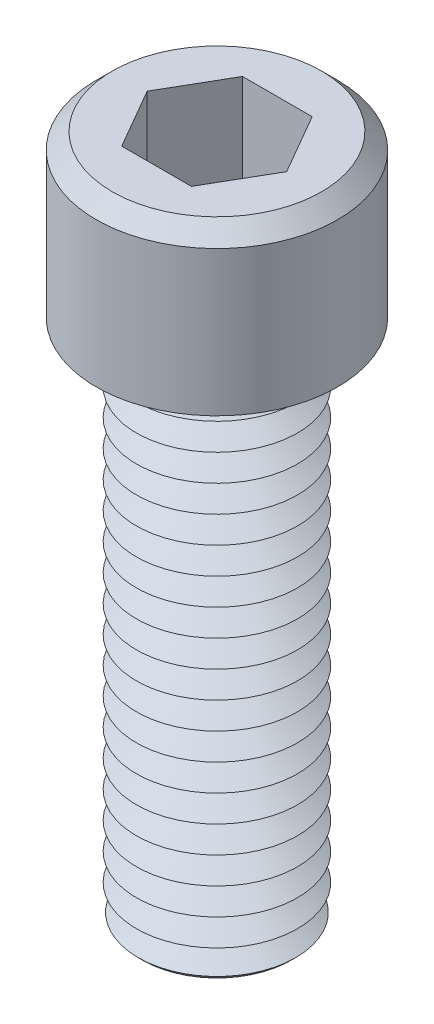
ISO-10303-21;
HEADER;
FILE_DESCRIPTION(('STEP AP214'),'2;1');
FILE_NAME('part.step','',(''),(''),'','','');
FILE_SCHEMA(('AUTOMOTIVE_DESIGN { 1 0 10303 214 1 1 1 1 }'));
ENDSEC;
DATA;
#1=APPLICATION_CONTEXT('core data for automotive mechanical design processes');
#2=APPLICATION_PROTOCOL_DEFINITION('international standard','automotive_design',2000,#1);
#3=PRODUCT_CONTEXT('',#1,'mechanical');
#4=PRODUCT('Part','Part','',(#3));
#5=PRODUCT_RELATED_PRODUCT_CATEGORY('part','',(#4));
#6=PRODUCT_DEFINITION_FORMATION('','',#4);
#7=PRODUCT_DEFINITION_CONTEXT('part definition',#1,'design');
#8=PRODUCT_DEFINITION('design','',#6,#7);
#9=PRODUCT_DEFINITION_SHAPE('','',#8);
#10=(LENGTH_UNIT() NAMED_UNIT(*) SI_UNIT(.MILLI.,.METRE.));
#11=(NAMED_UNIT(*) PLANE_ANGLE_UNIT() SI_UNIT($,.RADIAN.));
#12=(NAMED_UNIT(*) SI_UNIT($,.STERADIAN.) SOLID_ANGLE_UNIT());
#13=UNCERTAINTY_MEASURE_WITH_UNIT(LENGTH_MEASURE(1.E-05),#10,'distance_accuracy_value','');
#14=(GEOMETRIC_REPRESENTATION_CONTEXT(3) GLOBAL_UNCERTAINTY_ASSIGNED_CONTEXT((#13)) GLOBAL_UNIT_ASSIGNED_CONTEXT((#10,
#11,#12)) REPRESENTATION_CONTEXT('',''));
#15=CARTESIAN_POINT('',(0.,0.,0.));
#16=DIRECTION('',(0.,0.,1.));
#17=DIRECTION('',(1.,0.,0.));
#18=AXIS2_PLACEMENT_3D('',#15,#16,#17);
#19=CARTESIAN_POINT('',(0.,-15.0706666666666,0.));
#20=DIRECTION('',(0.,-1.,0.));
#21=DIRECTION('',(0.,0.,-1.));
#22=AXIS2_PLACEMENT_3D('',#19,#20,#21);
#23=CONICAL_SURFACE('',#22,1.71642690022272,1.04719755119659);
#24=CARTESIAN_POINT('',(0.,-15.4433926900222,0.));
#25=DIRECTION('',(0.,-1.,0.));
#26=DIRECTION('',(0.,0.,-1.));
#27=AXIS2_PLACEMENT_3D('',#24,#25,#26);
#28=CIRCLE('',#27,2.36200730997776);
#29=CARTESIAN_POINT('',(0.,-15.4433926900222,-2.36200730997776));
#30=VERTEX_POINT('',#29);
#31=EDGE_CURVE('E41',#30,#30,#28,.F.);
#32=ORIENTED_EDGE('',*,*,#31,.T.);
#33=EDGE_LOOP('',(#32));
#34=FACE_BOUND('',#33,.T.);
#35=CARTESIAN_POINT('',(0.,-15.0706666666666,0.));
#36=DIRECTION('',(0.,-1.,0.));
#37=DIRECTION('',(0.,0.,-1.));
#38=AXIS2_PLACEMENT_3D('',#35,#36,#37);
#39=CIRCLE('',#38,1.71642690022272);
#40=CARTESIAN_POINT('',(0.,-15.0706666666666,-1.71642690022272));
#41=VERTEX_POINT('',#40);
#42=EDGE_CURVE('E260',#41,#41,#39,.T.);
#43=ORIENTED_EDGE('',*,*,#42,.T.);
#44=EDGE_LOOP('',(#43));
#45=FACE_BOUND('',#44,.T.);
#46=ADVANCED_FACE('F32',(#34,#45),#23,.T.);
#47=CARTESIAN_POINT('',(0.,-14.6685,0.));
#48=DIRECTION('',(0.,1.,0.));
#49=DIRECTION('',(0.,0.,1.));
#50=AXIS2_PLACEMENT_3D('',#47,#48,#49);
#51=CONICAL_SURFACE('',#50,2.413,1.0471975511966);
#52=ORIENTED_EDGE('',*,*,#42,.F.);
#53=EDGE_LOOP('',(#52));
#54=FACE_BOUND('',#53,.T.);
#55=CARTESIAN_POINT('',(0.,-14.6685,0.));
#56=DIRECTION('',(0.,-1.,0.));
#57=DIRECTION('',(0.,0.,-1.));
#58=AXIS2_PLACEMENT_3D('',#55,#56,#57);
#59=CIRCLE('',#58,2.413);
#60=CARTESIAN_POINT('',(0.,-14.6685,-2.413));
#61=VERTEX_POINT('',#60);
#62=EDGE_CURVE('E257',#61,#61,#59,.T.);
#63=ORIENTED_EDGE('',*,*,#62,.T.);
#64=EDGE_LOOP('',(#63));
#65=FACE_BOUND('',#64,.T.);
#66=ADVANCED_FACE('F287',(#54,#65),#51,.T.);
#67=CARTESIAN_POINT('',(0.,-14.2663333333333,0.));
#68=DIRECTION('',(0.,-1.,0.));
#69=DIRECTION('',(0.,0.,-1.));
#70=AXIS2_PLACEMENT_3D('',#67,#68,#69);
#71=CONICAL_SURFACE('',#70,1.71642690022272,1.0471975511966);
#72=ORIENTED_EDGE('',*,*,#62,.F.);
#73=EDGE_LOOP('',(#72));
#74=FACE_BOUND('',#73,.T.);
#75=CARTESIAN_POINT('',(0.,-14.2663333333333,0.));
#76=DIRECTION('',(0.,-1.,0.));
#77=DIRECTION('',(0.,0.,-1.));
#78=AXIS2_PLACEMENT_3D('',#75,#76,#77);
#79=CIRCLE('',#78,1.71642690022272);
#80=CARTESIAN_POINT('',(0.,-14.2663333333333,-1.71642690022272));
#81=VERTEX_POINT('',#80);
#82=EDGE_CURVE('E254',#81,#81,#79,.T.);
#83=ORIENTED_EDGE('',*,*,#82,.T.);
#84=EDGE_LOOP('',(#83));
#85=FACE_BOUND('',#84,.T.);
#86=ADVANCED_FACE('F292',(#74,#85),#71,.T.);
#87=CARTESIAN_POINT('',(0.,-13.8641666666666,0.));
#88=DIRECTION('',(0.,1.,0.));
#89=DIRECTION('',(0.,0.,1.));
#90=AXIS2_PLACEMENT_3D('',#87,#88,#89);
#91=CONICAL_SURFACE('',#90,2.413,1.04719755119659);
#92=ORIENTED_EDGE('',*,*,#82,.F.);
#93=EDGE_LOOP('',(#92));
#94=FACE_BOUND('',#93,.T.);
#95=CARTESIAN_POINT('',(0.,-13.8641666666666,0.));
#96=DIRECTION('',(0.,-1.,0.));
#97=DIRECTION('',(0.,0.,-1.));
#98=AXIS2_PLACEMENT_3D('',#95,#96,#97);
#99=CIRCLE('',#98,2.413);
#100=CARTESIAN_POINT('',(0.,-13.8641666666666,-2.413));
#101=VERTEX_POINT('',#100);
#102=EDGE_CURVE('E251',#101,#101,#99,.T.);
#103=ORIENTED_EDGE('',*,*,#102,.T.);
#104=EDGE_LOOP('',(#103));
#105=FACE_BOUND('',#104,.T.);
#106=ADVANCED_FACE('F298',(#94,#105),#91,.T.);
#107=CARTESIAN_POINT('',(0.,-13.462,0.));
#108=DIRECTION('',(0.,-1.,0.));
#109=DIRECTION('',(0.,0.,-1.));
#110=AXIS2_PLACEMENT_3D('',#107,#108,#109);
#111=CONICAL_SURFACE('',#110,1.71642690022272,1.04719755119659);
#112=ORIENTED_EDGE('',*,*,#102,.F.);
#113=EDGE_LOOP('',(#112));
#114=FACE_BOUND('',#113,.T.);
#115=CARTESIAN_POINT('',(0.,-13.462,0.));
#116=DIRECTION('',(0.,-1.,0.));
#117=DIRECTION('',(0.,0.,-1.));
#118=AXIS2_PLACEMENT_3D('',#115,#116,#117);
#119=CIRCLE('',#118,1.71642690022272);
#120=CARTESIAN_POINT('',(0.,-13.462,-1.71642690022272));
#121=VERTEX_POINT('',#120);
#122=EDGE_CURVE('E248',#121,#121,#119,.T.);
#123=ORIENTED_EDGE('',*,*,#122,.T.);
#124=EDGE_LOOP('',(#123));
#125=FACE_BOUND('',#124,.T.);
#126=ADVANCED_FACE('F302',(#114,#125),#111,.T.);
#127=CARTESIAN_POINT('',(0.,-13.0598333333333,0.));
#128=DIRECTION('',(0.,1.,0.));
#129=DIRECTION('',(0.,0.,1.));
#130=AXIS2_PLACEMENT_3D('',#127,#128,#129);
#131=CONICAL_SURFACE('',#130,2.413,1.0471975511966);
#132=ORIENTED_EDGE('',*,*,#122,.F.);
#133=EDGE_LOOP('',(#132));
#134=FACE_BOUND('',#133,.T.);
#135=CARTESIAN_POINT('',(0.,-13.0598333333333,0.));
#136=DIRECTION('',(0.,-1.,0.));
#137=DIRECTION('',(0.,0.,-1.));
#138=AXIS2_PLACEMENT_3D('',#135,#136,#137);
#139=CIRCLE('',#138,2.413);
#140=CARTESIAN_POINT('',(0.,-13.0598333333333,-2.413));
#141=VERTEX_POINT('',#140);
#142=EDGE_CURVE('E245',#141,#141,#139,.T.);
#143=ORIENTED_EDGE('',*,*,#142,.T.);
#144=EDGE_LOOP('',(#143));
#145=FACE_BOUND('',#144,.T.);
#146=ADVANCED_FACE('F306',(#134,#145),#131,.T.);
#147=CARTESIAN_POINT('',(0.,-12.6576666666666,0.));
#148=DIRECTION('',(0.,-1.,0.));
#149=DIRECTION('',(0.,0.,-1.));
#150=AXIS2_PLACEMENT_3D('',#147,#148,#149);
#151=CONICAL_SURFACE('',#150,1.71642690022272,1.0471975511966);
#152=ORIENTED_EDGE('',*,*,#142,.F.);
#153=EDGE_LOOP('',(#152));
#154=FACE_BOUND('',#153,.T.);
#155=CARTESIAN_POINT('',(0.,-12.6576666666666,0.));
#156=DIRECTION('',(0.,-1.,0.));
#157=DIRECTION('',(0.,0.,-1.));
#158=AXIS2_PLACEMENT_3D('',#155,#156,#157);
#159=CIRCLE('',#158,1.71642690022272);
#160=CARTESIAN_POINT('',(0.,-12.6576666666666,-1.71642690022272));
#161=VERTEX_POINT('',#160);
#162=EDGE_CURVE('E242',#161,#161,#159,.T.);
#163=ORIENTED_EDGE('',*,*,#162,.T.);
#164=EDGE_LOOP('',(#163));
#165=FACE_BOUND('',#164,.T.);
#166=ADVANCED_FACE('F310',(#154,#165),#151,.T.);
#167=CARTESIAN_POINT('',(0.,-12.2555,0.));
#168=DIRECTION('',(0.,1.,0.));
#169=DIRECTION('',(0.,0.,1.));
#170=AXIS2_PLACEMENT_3D('',#167,#168,#169);
#171=CONICAL_SURFACE('',#170,2.413,1.04719755119659);
#172=ORIENTED_EDGE('',*,*,#162,.F.);
#173=EDGE_LOOP('',(#172));
#174=FACE_BOUND('',#173,.T.);
#175=CARTESIAN_POINT('',(0.,-12.2555,0.));
#176=DIRECTION('',(0.,-1.,0.));
#177=DIRECTION('',(0.,0.,-1.));
#178=AXIS2_PLACEMENT_3D('',#175,#176,#177);
#179=CIRCLE('',#178,2.413);
#180=CARTESIAN_POINT('',(0.,-12.2555,-2.413));
#181=VERTEX_POINT('',#180);
#182=EDGE_CURVE('E239',#181,#181,#179,.T.);
#183=ORIENTED_EDGE('',*,*,#182,.T.);
#184=EDGE_LOOP('',(#183));
#185=FACE_BOUND('',#184,.T.);
#186=ADVANCED_FACE('F314',(#174,#185),#171,.T.);
#187=CARTESIAN_POINT('',(0.,-11.8533333333333,0.));
#188=DIRECTION('',(0.,-1.,0.));
#189=DIRECTION('',(0.,0.,-1.));
#190=AXIS2_PLACEMENT_3D('',#187,#188,#189);
#191=CONICAL_SURFACE('',#190,1.71642690022272,1.04719755119659);
#192=ORIENTED_EDGE('',*,*,#182,.F.);
#193=EDGE_LOOP('',(#192));
#194=FACE_BOUND('',#193,.T.);
#195=CARTESIAN_POINT('',(0.,-11.8533333333333,0.));
#196=DIRECTION('',(0.,-1.,0.));
#197=DIRECTION('',(0.,0.,-1.));
#198=AXIS2_PLACEMENT_3D('',#195,#196,#197);
#199=CIRCLE('',#198,1.71642690022272);
#200=CARTESIAN_POINT('',(0.,-11.8533333333333,-1.71642690022272));
#201=VERTEX_POINT('',#200);
#202=EDGE_CURVE('E236',#201,#201,#199,.T.);
#203=ORIENTED_EDGE('',*,*,#202,.T.);
#204=EDGE_LOOP('',(#203));
#205=FACE_BOUND('',#204,.T.);
#206=ADVANCED_FACE('F318',(#194,#205),#191,.T.);
#207=CARTESIAN_POINT('',(0.,-11.4511666666666,0.));
#208=DIRECTION('',(0.,1.,0.));
#209=DIRECTION('',(0.,0.,1.));
#210=AXIS2_PLACEMENT_3D('',#207,#208,#209);
#211=CONICAL_SURFACE('',#210,2.413,1.0471975511966);
#212=ORIENTED_EDGE('',*,*,#202,.F.);
#213=EDGE_LOOP('',(#212));
#214=FACE_BOUND('',#213,.T.);
#215=CARTESIAN_POINT('',(0.,-11.4511666666666,0.));
#216=DIRECTION('',(0.,-1.,0.));
#217=DIRECTION('',(0.,0.,-1.));
#218=AXIS2_PLACEMENT_3D('',#215,#216,#217);
#219=CIRCLE('',#218,2.413);
#220=CARTESIAN_POINT('',(0.,-11.4511666666666,-2.413));
#221=VERTEX_POINT('',#220);
#222=EDGE_CURVE('E233',#221,#221,#219,.T.);
#223=ORIENTED_EDGE('',*,*,#222,.T.);
#224=EDGE_LOOP('',(#223));
#225=FACE_BOUND('',#224,.T.);
#226=ADVANCED_FACE('F322',(#214,#225),#211,.T.);
#227=CARTESIAN_POINT('',(0.,-11.049,0.));
#228=DIRECTION('',(0.,-1.,0.));
#229=DIRECTION('',(0.,0.,-1.));
#230=AXIS2_PLACEMENT_3D('',#227,#228,#229);
#231=CONICAL_SURFACE('',#230,1.71642690022272,1.0471975511966);
#232=ORIENTED_EDGE('',*,*,#222,.F.);
#233=EDGE_LOOP('',(#232));
#234=FACE_BOUND('',#233,.T.);
#235=CARTESIAN_POINT('',(0.,-11.049,0.));
#236=DIRECTION('',(0.,-1.,0.));
#237=DIRECTION('',(0.,0.,-1.));
#238=AXIS2_PLACEMENT_3D('',#235,#236,#237);
#239=CIRCLE('',#238,1.71642690022272);
#240=CARTESIAN_POINT('',(0.,-11.049,-1.71642690022272));
#241=VERTEX_POINT('',#240);
#242=EDGE_CURVE('E230',#241,#241,#239,.T.);
#243=ORIENTED_EDGE('',*,*,#242,.T.);
#244=EDGE_LOOP('',(#243));
#245=FACE_BOUND('',#244,.T.);
#246=ADVANCED_FACE('F326',(#234,#245),#231,.T.);
#247=CARTESIAN_POINT('',(0.,-10.6468333333333,0.));
#248=DIRECTION('',(0.,1.,0.));
#249=DIRECTION('',(0.,0.,1.));
#250=AXIS2_PLACEMENT_3D('',#247,#248,#249);
#251=CONICAL_SURFACE('',#250,2.413,1.04719755119659);
#252=ORIENTED_EDGE('',*,*,#242,.F.);
#253=EDGE_LOOP('',(#252));
#254=FACE_BOUND('',#253,.T.);
#255=CARTESIAN_POINT('',(0.,-10.6468333333333,0.));
#256=DIRECTION('',(0.,-1.,0.));
#257=DIRECTION('',(0.,0.,-1.));
#258=AXIS2_PLACEMENT_3D('',#255,#256,#257);
#259=CIRCLE('',#258,2.413);
#260=CARTESIAN_POINT('',(0.,-10.6468333333333,-2.413));
#261=VERTEX_POINT('',#260);
#262=EDGE_CURVE('E227',#261,#261,#259,.T.);
#263=ORIENTED_EDGE('',*,*,#262,.T.);
#264=EDGE_LOOP('',(#263));
#265=FACE_BOUND('',#264,.T.);
#266=ADVANCED_FACE('F330',(#254,#265),#251,.T.);
#267=CARTESIAN_POINT('',(0.,-10.2446666666666,0.));
#268=DIRECTION('',(0.,-1.,0.));
#269=DIRECTION('',(0.,0.,-1.));
#270=AXIS2_PLACEMENT_3D('',#267,#268,#269);
#271=CONICAL_SURFACE('',#270,1.71642690022272,1.04719755119659);
#272=ORIENTED_EDGE('',*,*,#262,.F.);
#273=EDGE_LOOP('',(#272));
#274=FACE_BOUND('',#273,.T.);
#275=CARTESIAN_POINT('',(0.,-10.2446666666666,0.));
#276=DIRECTION('',(0.,-1.,0.));
#277=DIRECTION('',(0.,0.,-1.));
#278=AXIS2_PLACEMENT_3D('',#275,#276,#277);
#279=CIRCLE('',#278,1.71642690022272);
#280=CARTESIAN_POINT('',(0.,-10.2446666666666,-1.71642690022272));
#281=VERTEX_POINT('',#280);
#282=EDGE_CURVE('E224',#281,#281,#279,.T.);
#283=ORIENTED_EDGE('',*,*,#282,.T.);
#284=EDGE_LOOP('',(#283));
#285=FACE_BOUND('',#284,.T.);
#286=ADVANCED_FACE('F334',(#274,#285),#271,.T.);
#287=CARTESIAN_POINT('',(0.,-9.84249999999998,0.));
#288=DIRECTION('',(0.,1.,0.));
#289=DIRECTION('',(0.,0.,1.));
#290=AXIS2_PLACEMENT_3D('',#287,#288,#289);
#291=CONICAL_SURFACE('',#290,2.413,1.0471975511966);
#292=ORIENTED_EDGE('',*,*,#282,.F.);
#293=EDGE_LOOP('',(#292));
#294=FACE_BOUND('',#293,.T.);
#295=CARTESIAN_POINT('',(0.,-9.84249999999998,0.));
#296=DIRECTION('',(0.,-1.,0.));
#297=DIRECTION('',(0.,0.,-1.));
#298=AXIS2_PLACEMENT_3D('',#295,#296,#297);
#299=CIRCLE('',#298,2.413);
#300=CARTESIAN_POINT('',(0.,-9.84249999999998,-2.413));
#301=VERTEX_POINT('',#300);
#302=EDGE_CURVE('E221',#301,#301,#299,.T.);
#303=ORIENTED_EDGE('',*,*,#302,.T.);
#304=EDGE_LOOP('',(#303));
#305=FACE_BOUND('',#304,.T.);
#306=ADVANCED_FACE('F338',(#294,#305),#291,.T.);
#307=CARTESIAN_POINT('',(0.,-9.44033333333331,0.));
#308=DIRECTION('',(0.,-1.,0.));
#309=DIRECTION('',(0.,0.,-1.));
#310=AXIS2_PLACEMENT_3D('',#307,#308,#309);
#311=CONICAL_SURFACE('',#310,1.71642690022272,1.0471975511966);
#312=ORIENTED_EDGE('',*,*,#302,.F.);
#313=EDGE_LOOP('',(#312));
#314=FACE_BOUND('',#313,.T.);
#315=CARTESIAN_POINT('',(0.,-9.44033333333331,0.));
#316=DIRECTION('',(0.,-1.,0.));
#317=DIRECTION('',(0.,0.,-1.));
#318=AXIS2_PLACEMENT_3D('',#315,#316,#317);
#319=CIRCLE('',#318,1.71642690022272);
#320=CARTESIAN_POINT('',(0.,-9.44033333333331,-1.71642690022272));
#321=VERTEX_POINT('',#320);
#322=EDGE_CURVE('E218',#321,#321,#319,.T.);
#323=ORIENTED_EDGE('',*,*,#322,.T.);
#324=EDGE_LOOP('',(#323));
#325=FACE_BOUND('',#324,.T.);
#326=ADVANCED_FACE('F342',(#314,#325),#311,.T.);
#327=CARTESIAN_POINT('',(0.,-9.03816666666665,0.));
#328=DIRECTION('',(0.,1.,0.));
#329=DIRECTION('',(0.,0.,1.));
#330=AXIS2_PLACEMENT_3D('',#327,#328,#329);
#331=CONICAL_SURFACE('',#330,2.413,1.0471975511966);
#332=ORIENTED_EDGE('',*,*,#322,.F.);
#333=EDGE_LOOP('',(#332));
#334=FACE_BOUND('',#333,.T.);
#335=CARTESIAN_POINT('',(0.,-9.03816666666665,0.));
#336=DIRECTION('',(0.,-1.,0.));
#337=DIRECTION('',(0.,0.,-1.));
#338=AXIS2_PLACEMENT_3D('',#335,#336,#337);
#339=CIRCLE('',#338,2.413);
#340=CARTESIAN_POINT('',(0.,-9.03816666666665,-2.413));
#341=VERTEX_POINT('',#340);
#342=EDGE_CURVE('E215',#341,#341,#339,.T.);
#343=ORIENTED_EDGE('',*,*,#342,.T.);
#344=EDGE_LOOP('',(#343));
#345=FACE_BOUND('',#344,.T.);
#346=ADVANCED_FACE('F346',(#334,#345),#331,.T.);
#347=CARTESIAN_POINT('',(0.,-8.63599999999998,0.));
#348=DIRECTION('',(0.,-1.,0.));
#349=DIRECTION('',(0.,0.,-1.));
#350=AXIS2_PLACEMENT_3D('',#347,#348,#349);
#351=CONICAL_SURFACE('',#350,1.71642690022272,1.04719755119659);
#352=ORIENTED_EDGE('',*,*,#342,.F.);
#353=EDGE_LOOP('',(#352));
#354=FACE_BOUND('',#353,.T.);
#355=CARTESIAN_POINT('',(0.,-8.63599999999998,0.));
#356=DIRECTION('',(0.,-1.,0.));
#357=DIRECTION('',(0.,0.,-1.));
#358=AXIS2_PLACEMENT_3D('',#355,#356,#357);
#359=CIRCLE('',#358,1.71642690022272);
#360=CARTESIAN_POINT('',(0.,-8.63599999999998,-1.71642690022272));
#361=VERTEX_POINT('',#360);
#362=EDGE_CURVE('E212',#361,#361,#359,.T.);
#363=ORIENTED_EDGE('',*,*,#362,.T.);
#364=EDGE_LOOP('',(#363));
#365=FACE_BOUND('',#364,.T.);
#366=ADVANCED_FACE('F350',(#354,#365),#351,.T.);
#367=CARTESIAN_POINT('',(0.,-8.23383333333332,0.));
#368=DIRECTION('',(0.,1.,0.));
#369=DIRECTION('',(0.,0.,1.));
#370=AXIS2_PLACEMENT_3D('',#367,#368,#369);
#371=CONICAL_SURFACE('',#370,2.413,1.04719755119659);
#372=ORIENTED_EDGE('',*,*,#362,.F.);
#373=EDGE_LOOP('',(#372));
#374=FACE_BOUND('',#373,.T.);
#375=CARTESIAN_POINT('',(0.,-8.23383333333332,0.));
#376=DIRECTION('',(0.,-1.,0.));
#377=DIRECTION('',(0.,0.,-1.));
#378=AXIS2_PLACEMENT_3D('',#375,#376,#377);
#379=CIRCLE('',#378,2.413);
#380=CARTESIAN_POINT('',(0.,-8.23383333333332,-2.413));
#381=VERTEX_POINT('',#380);
#382=EDGE_CURVE('E209',#381,#381,#379,.T.);
#383=ORIENTED_EDGE('',*,*,#382,.T.);
#384=EDGE_LOOP('',(#383));
#385=FACE_BOUND('',#384,.T.);
#386=ADVANCED_FACE('F354',(#374,#385),#371,.T.);
#387=CARTESIAN_POINT('',(0.,-7.83166666666665,0.));
#388=DIRECTION('',(0.,-1.,0.));
#389=DIRECTION('',(0.,0.,-1.));
#390=AXIS2_PLACEMENT_3D('',#387,#388,#389);
#391=CONICAL_SURFACE('',#390,1.71642690022272,1.0471975511966);
#392=ORIENTED_EDGE('',*,*,#382,.F.);
#393=EDGE_LOOP('',(#392));
#394=FACE_BOUND('',#393,.T.);
#395=CARTESIAN_POINT('',(0.,-7.83166666666665,0.));
#396=DIRECTION('',(0.,-1.,0.));
#397=DIRECTION('',(0.,0.,-1.));
#398=AXIS2_PLACEMENT_3D('',#395,#396,#397);
#399=CIRCLE('',#398,1.71642690022272);
#400=CARTESIAN_POINT('',(0.,-7.83166666666665,-1.71642690022272));
#401=VERTEX_POINT('',#400);
#402=EDGE_CURVE('E206',#401,#401,#399,.T.);
#403=ORIENTED_EDGE('',*,*,#402,.T.);
#404=EDGE_LOOP('',(#403));
#405=FACE_BOUND('',#404,.T.);
#406=ADVANCED_FACE('F358',(#394,#405),#391,.T.);
#407=CARTESIAN_POINT('',(0.,-7.42949999999998,0.));
#408=DIRECTION('',(0.,1.,0.));
#409=DIRECTION('',(0.,0.,1.));
#410=AXIS2_PLACEMENT_3D('',#407,#408,#409);
#411=CONICAL_SURFACE('',#410,2.413,1.04719755119659);
#412=ORIENTED_EDGE('',*,*,#402,.F.);
#413=EDGE_LOOP('',(#412));
#414=FACE_BOUND('',#413,.T.);
#415=CARTESIAN_POINT('',(0.,-7.42949999999998,0.));
#416=DIRECTION('',(0.,-1.,0.));
#417=DIRECTION('',(0.,0.,-1.));
#418=AXIS2_PLACEMENT_3D('',#415,#416,#417);
#419=CIRCLE('',#418,2.413);
#420=CARTESIAN_POINT('',(0.,-7.42949999999998,-2.413));
#421=VERTEX_POINT('',#420);
#422=EDGE_CURVE('E203',#421,#421,#419,.T.);
#423=ORIENTED_EDGE('',*,*,#422,.T.);
#424=EDGE_LOOP('',(#423));
#425=FACE_BOUND('',#424,.T.);
#426=ADVANCED_FACE('F362',(#414,#425),#411,.T.);
#427=CARTESIAN_POINT('',(0.,-7.02733333333332,0.));
#428=DIRECTION('',(0.,-1.,0.));
#429=DIRECTION('',(0.,0.,-1.));
#430=AXIS2_PLACEMENT_3D('',#427,#428,#429);
#431=CONICAL_SURFACE('',#430,1.71642690022272,1.04719755119659);
#432=ORIENTED_EDGE('',*,*,#422,.F.);
#433=EDGE_LOOP('',(#432));
#434=FACE_BOUND('',#433,.T.);
#435=CARTESIAN_POINT('',(0.,-7.02733333333332,0.));
#436=DIRECTION('',(0.,-1.,0.));
#437=DIRECTION('',(0.,0.,-1.));
#438=AXIS2_PLACEMENT_3D('',#435,#436,#437);
#439=CIRCLE('',#438,1.71642690022272);
#440=CARTESIAN_POINT('',(0.,-7.02733333333332,-1.71642690022272));
#441=VERTEX_POINT('',#440);
#442=EDGE_CURVE('E200',#441,#441,#439,.T.);
#443=ORIENTED_EDGE('',*,*,#442,.T.);
#444=EDGE_LOOP('',(#443));
#445=FACE_BOUND('',#444,.T.);
#446=ADVANCED_FACE('F366',(#434,#445),#431,.T.);
#447=CARTESIAN_POINT('',(0.,-6.62516666666665,0.));
#448=DIRECTION('',(0.,1.,0.));
#449=DIRECTION('',(0.,0.,1.));
#450=AXIS2_PLACEMENT_3D('',#447,#448,#449);
#451=CONICAL_SURFACE('',#450,2.413,1.0471975511966);
#452=ORIENTED_EDGE('',*,*,#442,.F.);
#453=EDGE_LOOP('',(#452));
#454=FACE_BOUND('',#453,.T.);
#455=CARTESIAN_POINT('',(0.,-6.62516666666665,0.));
#456=DIRECTION('',(0.,-1.,0.));
#457=DIRECTION('',(0.,0.,-1.));
#458=AXIS2_PLACEMENT_3D('',#455,#456,#457);
#459=CIRCLE('',#458,2.413);
#460=CARTESIAN_POINT('',(0.,-6.62516666666665,-2.413));
#461=VERTEX_POINT('',#460);
#462=EDGE_CURVE('E197',#461,#461,#459,.T.);
#463=ORIENTED_EDGE('',*,*,#462,.T.);
#464=EDGE_LOOP('',(#463));
#465=FACE_BOUND('',#464,.T.);
#466=ADVANCED_FACE('F370',(#454,#465),#451,.T.);
#467=CARTESIAN_POINT('',(0.,-6.22299999999999,0.));
#468=DIRECTION('',(0.,-1.,0.));
#469=DIRECTION('',(0.,0.,-1.));
#470=AXIS2_PLACEMENT_3D('',#467,#468,#469);
#471=CONICAL_SURFACE('',#470,1.71642690022272,1.04719755119659);
#472=ORIENTED_EDGE('',*,*,#462,.F.);
#473=EDGE_LOOP('',(#472));
#474=FACE_BOUND('',#473,.T.);
#475=CARTESIAN_POINT('',(0.,-6.22299999999999,0.));
#476=DIRECTION('',(0.,-1.,0.));
#477=DIRECTION('',(0.,0.,-1.));
#478=AXIS2_PLACEMENT_3D('',#475,#476,#477);
#479=CIRCLE('',#478,1.71642690022272);
#480=CARTESIAN_POINT('',(0.,-6.22299999999999,-1.71642690022272));
#481=VERTEX_POINT('',#480);
#482=EDGE_CURVE('E194',#481,#481,#479,.T.);
#483=ORIENTED_EDGE('',*,*,#482,.T.);
#484=EDGE_LOOP('',(#483));
#485=FACE_BOUND('',#484,.T.);
#486=ADVANCED_FACE('F374',(#474,#485),#471,.T.);
#487=CARTESIAN_POINT('',(0.,-5.82083333333332,0.));
#488=DIRECTION('',(0.,1.,0.));
#489=DIRECTION('',(0.,0.,1.));
#490=AXIS2_PLACEMENT_3D('',#487,#488,#489);
#491=CONICAL_SURFACE('',#490,2.413,1.04719755119659);
#492=ORIENTED_EDGE('',*,*,#482,.F.);
#493=EDGE_LOOP('',(#492));
#494=FACE_BOUND('',#493,.T.);
#495=CARTESIAN_POINT('',(0.,-5.82083333333332,0.));
#496=DIRECTION('',(0.,-1.,0.));
#497=DIRECTION('',(0.,0.,-1.));
#498=AXIS2_PLACEMENT_3D('',#495,#496,#497);
#499=CIRCLE('',#498,2.413);
#500=CARTESIAN_POINT('',(0.,-5.82083333333332,-2.413));
#501=VERTEX_POINT('',#500);
#502=EDGE_CURVE('E191',#501,#501,#499,.T.);
#503=ORIENTED_EDGE('',*,*,#502,.T.);
#504=EDGE_LOOP('',(#503));
#505=FACE_BOUND('',#504,.T.);
#506=ADVANCED_FACE('F378',(#494,#505),#491,.T.);
#507=CARTESIAN_POINT('',(0.,-5.41866666666666,0.));
#508=DIRECTION('',(0.,-1.,0.));
#509=DIRECTION('',(0.,0.,-1.));
#510=AXIS2_PLACEMENT_3D('',#507,#508,#509);
#511=CONICAL_SURFACE('',#510,1.71642690022272,1.0471975511966);
#512=ORIENTED_EDGE('',*,*,#502,.F.);
#513=EDGE_LOOP('',(#512));
#514=FACE_BOUND('',#513,.T.);
#515=CARTESIAN_POINT('',(0.,-5.41866666666666,0.));
#516=DIRECTION('',(0.,-1.,0.));
#517=DIRECTION('',(0.,0.,-1.));
#518=AXIS2_PLACEMENT_3D('',#515,#516,#517);
#519=CIRCLE('',#518,1.71642690022272);
#520=CARTESIAN_POINT('',(0.,-5.41866666666666,-1.71642690022272));
#521=VERTEX_POINT('',#520);
#522=EDGE_CURVE('E188',#521,#521,#519,.T.);
#523=ORIENTED_EDGE('',*,*,#522,.T.);
#524=EDGE_LOOP('',(#523));
#525=FACE_BOUND('',#524,.T.);
#526=ADVANCED_FACE('F382',(#514,#525),#511,.T.);
#527=CARTESIAN_POINT('',(0.,-5.01649999999999,0.));
#528=DIRECTION('',(0.,1.,0.));
#529=DIRECTION('',(0.,0.,1.));
#530=AXIS2_PLACEMENT_3D('',#527,#528,#529);
#531=CONICAL_SURFACE('',#530,2.413,1.04719755119659);
#532=ORIENTED_EDGE('',*,*,#522,.F.);
#533=EDGE_LOOP('',(#532));
#534=FACE_BOUND('',#533,.T.);
#535=CARTESIAN_POINT('',(0.,-5.01649999999999,0.));
#536=DIRECTION('',(0.,-1.,0.));
#537=DIRECTION('',(0.,0.,-1.));
#538=AXIS2_PLACEMENT_3D('',#535,#536,#537);
#539=CIRCLE('',#538,2.413);
#540=CARTESIAN_POINT('',(0.,-5.01649999999999,-2.413));
#541=VERTEX_POINT('',#540);
#542=EDGE_CURVE('E185',#541,#541,#539,.T.);
#543=ORIENTED_EDGE('',*,*,#542,.T.);
#544=EDGE_LOOP('',(#543));
#545=FACE_BOUND('',#544,.T.);
#546=ADVANCED_FACE('F386',(#534,#545),#531,.T.);
#547=CARTESIAN_POINT('',(0.,-4.61433333333332,0.));
#548=DIRECTION('',(0.,-1.,0.));
#549=DIRECTION('',(0.,0.,-1.));
#550=AXIS2_PLACEMENT_3D('',#547,#548,#549);
#551=CONICAL_SURFACE('',#550,1.71642690022272,1.04719755119659);
#552=ORIENTED_EDGE('',*,*,#542,.F.);
#553=EDGE_LOOP('',(#552));
#554=FACE_BOUND('',#553,.T.);
#555=CARTESIAN_POINT('',(0.,-4.61433333333332,0.));
#556=DIRECTION('',(0.,-1.,0.));
#557=DIRECTION('',(0.,0.,-1.));
#558=AXIS2_PLACEMENT_3D('',#555,#556,#557);
#559=CIRCLE('',#558,1.71642690022272);
#560=CARTESIAN_POINT('',(0.,-4.61433333333332,-1.71642690022272));
#561=VERTEX_POINT('',#560);
#562=EDGE_CURVE('E182',#561,#561,#559,.T.);
#563=ORIENTED_EDGE('',*,*,#562,.T.);
#564=EDGE_LOOP('',(#563));
#565=FACE_BOUND('',#564,.T.);
#566=ADVANCED_FACE('F390',(#554,#565),#551,.T.);
#567=CARTESIAN_POINT('',(0.,-4.21216666666666,0.));
#568=DIRECTION('',(0.,1.,0.));
#569=DIRECTION('',(0.,0.,1.));
#570=AXIS2_PLACEMENT_3D('',#567,#568,#569);
#571=CONICAL_SURFACE('',#570,2.413,1.0471975511966);
#572=ORIENTED_EDGE('',*,*,#562,.F.);
#573=EDGE_LOOP('',(#572));
#574=FACE_BOUND('',#573,.T.);
#575=CARTESIAN_POINT('',(0.,-4.21216666666666,0.));
#576=DIRECTION('',(0.,-1.,0.));
#577=DIRECTION('',(0.,0.,-1.));
#578=AXIS2_PLACEMENT_3D('',#575,#576,#577);
#579=CIRCLE('',#578,2.413);
#580=CARTESIAN_POINT('',(0.,-4.21216666666666,-2.413));
#581=VERTEX_POINT('',#580);
#582=EDGE_CURVE('E179',#581,#581,#579,.T.);
#583=ORIENTED_EDGE('',*,*,#582,.T.);
#584=EDGE_LOOP('',(#583));
#585=FACE_BOUND('',#584,.T.);
#586=ADVANCED_FACE('F394',(#574,#585),#571,.T.);
#587=CARTESIAN_POINT('',(0.,-3.80999999999999,0.));
#588=DIRECTION('',(0.,-1.,0.));
#589=DIRECTION('',(0.,0.,-1.));
#590=AXIS2_PLACEMENT_3D('',#587,#588,#589);
#591=CONICAL_SURFACE('',#590,1.71642690022272,1.04719755119659);
#592=ORIENTED_EDGE('',*,*,#582,.F.);
#593=EDGE_LOOP('',(#592));
#594=FACE_BOUND('',#593,.T.);
#595=CARTESIAN_POINT('',(0.,-3.80999999999999,0.));
#596=DIRECTION('',(0.,-1.,0.));
#597=DIRECTION('',(0.,0.,-1.));
#598=AXIS2_PLACEMENT_3D('',#595,#596,#597);
#599=CIRCLE('',#598,1.71642690022272);
#600=CARTESIAN_POINT('',(0.,-3.80999999999999,-1.71642690022272));
#601=VERTEX_POINT('',#600);
#602=EDGE_CURVE('E176',#601,#601,#599,.T.);
#603=ORIENTED_EDGE('',*,*,#602,.T.);
#604=EDGE_LOOP('',(#603));
#605=FACE_BOUND('',#604,.T.);
#606=ADVANCED_FACE('F398',(#594,#605),#591,.T.);
#607=CARTESIAN_POINT('',(0.,-3.40783333333333,0.));
#608=DIRECTION('',(0.,1.,0.));
#609=DIRECTION('',(0.,0.,1.));
#610=AXIS2_PLACEMENT_3D('',#607,#608,#609);
#611=CONICAL_SURFACE('',#610,2.413,1.0471975511966);
#612=ORIENTED_EDGE('',*,*,#602,.F.);
#613=EDGE_LOOP('',(#612));
#614=FACE_BOUND('',#613,.T.);
#615=CARTESIAN_POINT('',(0.,-3.40783333333333,0.));
#616=DIRECTION('',(0.,-1.,0.));
#617=DIRECTION('',(0.,0.,-1.));
#618=AXIS2_PLACEMENT_3D('',#615,#616,#617);
#619=CIRCLE('',#618,2.413);
#620=CARTESIAN_POINT('',(0.,-3.40783333333333,-2.413));
#621=VERTEX_POINT('',#620);
#622=EDGE_CURVE('E173',#621,#621,#619,.T.);
#623=ORIENTED_EDGE('',*,*,#622,.T.);
#624=EDGE_LOOP('',(#623));
#625=FACE_BOUND('',#624,.T.);
#626=ADVANCED_FACE('F402',(#614,#625),#611,.T.);
#627=CARTESIAN_POINT('',(0.,-3.00566666666666,0.));
#628=DIRECTION('',(0.,-1.,0.));
#629=DIRECTION('',(0.,0.,-1.));
#630=AXIS2_PLACEMENT_3D('',#627,#628,#629);
#631=CONICAL_SURFACE('',#630,1.71642690022272,1.04719755119659);
#632=ORIENTED_EDGE('',*,*,#622,.F.);
#633=EDGE_LOOP('',(#632));
#634=FACE_BOUND('',#633,.T.);
#635=CARTESIAN_POINT('',(0.,-3.00566666666666,0.));
#636=DIRECTION('',(0.,-1.,0.));
#637=DIRECTION('',(0.,0.,-1.));
#638=AXIS2_PLACEMENT_3D('',#635,#636,#637);
#639=CIRCLE('',#638,1.71642690022272);
#640=CARTESIAN_POINT('',(0.,-3.00566666666666,-1.71642690022272));
#641=VERTEX_POINT('',#640);
#642=EDGE_CURVE('E170',#641,#641,#639,.T.);
#643=ORIENTED_EDGE('',*,*,#642,.T.);
#644=EDGE_LOOP('',(#643));
#645=FACE_BOUND('',#644,.T.);
#646=ADVANCED_FACE('F406',(#634,#645),#631,.T.);
#647=CARTESIAN_POINT('',(0.,-2.60349999999999,0.));
#648=DIRECTION('',(0.,1.,0.));
#649=DIRECTION('',(0.,0.,1.));
#650=AXIS2_PLACEMENT_3D('',#647,#648,#649);
#651=CONICAL_SURFACE('',#650,2.413,1.0471975511966);
#652=ORIENTED_EDGE('',*,*,#642,.F.);
#653=EDGE_LOOP('',(#652));
#654=FACE_BOUND('',#653,.T.);
#655=CARTESIAN_POINT('',(0.,-2.60349999999999,0.));
#656=DIRECTION('',(0.,-1.,0.));
#657=DIRECTION('',(0.,0.,-1.));
#658=AXIS2_PLACEMENT_3D('',#655,#656,#657);
#659=CIRCLE('',#658,2.413);
#660=CARTESIAN_POINT('',(0.,-2.60349999999999,-2.413));
#661=VERTEX_POINT('',#660);
#662=EDGE_CURVE('E167',#661,#661,#659,.T.);
#663=ORIENTED_EDGE('',*,*,#662,.T.);
#664=EDGE_LOOP('',(#663));
#665=FACE_BOUND('',#664,.T.);
#666=ADVANCED_FACE('F410',(#654,#665),#651,.T.);
#667=CARTESIAN_POINT('',(0.,-2.20133333333333,0.));
#668=DIRECTION('',(0.,-1.,0.));
#669=DIRECTION('',(0.,0.,-1.));
#670=AXIS2_PLACEMENT_3D('',#667,#668,#669);
#671=CONICAL_SURFACE('',#670,1.71642690022272,1.04719755119659);
#672=ORIENTED_EDGE('',*,*,#662,.F.);
#673=EDGE_LOOP('',(#672));
#674=FACE_BOUND('',#673,.T.);
#675=CARTESIAN_POINT('',(0.,-2.20133333333333,0.));
#676=DIRECTION('',(0.,-1.,0.));
#677=DIRECTION('',(0.,0.,-1.));
#678=AXIS2_PLACEMENT_3D('',#675,#676,#677);
#679=CIRCLE('',#678,1.71642690022272);
#680=CARTESIAN_POINT('',(0.,-2.20133333333333,-1.71642690022272));
#681=VERTEX_POINT('',#680);
#682=EDGE_CURVE('E164',#681,#681,#679,.T.);
#683=ORIENTED_EDGE('',*,*,#682,.T.);
#684=EDGE_LOOP('',(#683));
#685=FACE_BOUND('',#684,.T.);
#686=ADVANCED_FACE('F414',(#674,#685),#671,.T.);
#687=CARTESIAN_POINT('',(0.,-1.79916666666666,0.));
#688=DIRECTION('',(0.,1.,0.));
#689=DIRECTION('',(0.,0.,1.));
#690=AXIS2_PLACEMENT_3D('',#687,#688,#689);
#691=CONICAL_SURFACE('',#690,2.413,1.04719755119659);
#692=ORIENTED_EDGE('',*,*,#682,.F.);
#693=EDGE_LOOP('',(#692));
#694=FACE_BOUND('',#693,.T.);
#695=CARTESIAN_POINT('',(0.,-1.79916666666666,0.));
#696=DIRECTION('',(0.,-1.,0.));
#697=DIRECTION('',(0.,0.,-1.));
#698=AXIS2_PLACEMENT_3D('',#695,#696,#697);
#699=CIRCLE('',#698,2.413);
#700=CARTESIAN_POINT('',(0.,-1.79916666666666,-2.413));
#701=VERTEX_POINT('',#700);
#702=EDGE_CURVE('E161',#701,#701,#699,.T.);
#703=ORIENTED_EDGE('',*,*,#702,.T.);
#704=EDGE_LOOP('',(#703));
#705=FACE_BOUND('',#704,.T.);
#706=ADVANCED_FACE('F418',(#694,#705),#691,.T.);
#707=CARTESIAN_POINT('',(0.,-1.397,0.));
#708=DIRECTION('',(0.,-1.,0.));
#709=DIRECTION('',(0.,0.,-1.));
#710=AXIS2_PLACEMENT_3D('',#707,#708,#709);
#711=CONICAL_SURFACE('',#710,1.71642690022272,1.0471975511966);
#712=ORIENTED_EDGE('',*,*,#702,.F.);
#713=EDGE_LOOP('',(#712));
#714=FACE_BOUND('',#713,.T.);
#715=CARTESIAN_POINT('',(0.,-1.397,0.));
#716=DIRECTION('',(0.,-1.,0.));
#717=DIRECTION('',(0.,0.,-1.));
#718=AXIS2_PLACEMENT_3D('',#715,#716,#717);
#719=CIRCLE('',#718,1.71642690022272);
#720=CARTESIAN_POINT('',(0.,-1.397,-1.71642690022272));
#721=VERTEX_POINT('',#720);
#722=EDGE_CURVE('E158',#721,#721,#719,.T.);
#723=ORIENTED_EDGE('',*,*,#722,.T.);
#724=EDGE_LOOP('',(#723));
#725=FACE_BOUND('',#724,.T.);
#726=ADVANCED_FACE('F422',(#714,#725),#711,.T.);
#727=CARTESIAN_POINT('',(0.,-0.994833333333327,0.));
#728=DIRECTION('',(0.,1.,0.));
#729=DIRECTION('',(0.,0.,1.));
#730=AXIS2_PLACEMENT_3D('',#727,#728,#729);
#731=CONICAL_SURFACE('',#730,2.413,1.04719755119659);
#732=ORIENTED_EDGE('',*,*,#722,.F.);
#733=EDGE_LOOP('',(#732));
#734=FACE_BOUND('',#733,.T.);
#735=CARTESIAN_POINT('',(0.,-0.994833333333327,0.));
#736=DIRECTION('',(0.,-1.,0.));
#737=DIRECTION('',(0.,0.,-1.));
#738=AXIS2_PLACEMENT_3D('',#735,#736,#737);
#739=CIRCLE('',#738,2.413);
#740=CARTESIAN_POINT('',(0.,-0.994833333333327,-2.413));
#741=VERTEX_POINT('',#740);
#742=EDGE_CURVE('E155',#741,#741,#739,.T.);
#743=ORIENTED_EDGE('',*,*,#742,.T.);
#744=EDGE_LOOP('',(#743));
#745=FACE_BOUND('',#744,.T.);
#746=ADVANCED_FACE('F426',(#734,#745),#731,.T.);
#747=CARTESIAN_POINT('',(0.,-0.592666666666665,0.));
#748=DIRECTION('',(0.,-1.,0.));
#749=DIRECTION('',(0.,0.,-1.));
#750=AXIS2_PLACEMENT_3D('',#747,#748,#749);
#751=CONICAL_SURFACE('',#750,1.71642690022272,1.0471975511966);
#752=ORIENTED_EDGE('',*,*,#742,.F.);
#753=EDGE_LOOP('',(#752));
#754=FACE_BOUND('',#753,.T.);
#755=CARTESIAN_POINT('',(0.,-0.592666666666665,0.));
#756=DIRECTION('',(0.,-1.,0.));
#757=DIRECTION('',(0.,0.,-1.));
#758=AXIS2_PLACEMENT_3D('',#755,#756,#757);
#759=CIRCLE('',#758,1.71642690022272);
#760=CARTESIAN_POINT('',(0.,-0.592666666666665,-1.71642690022272));
#761=VERTEX_POINT('',#760);
#762=EDGE_CURVE('E152',#761,#761,#759,.T.);
#763=ORIENTED_EDGE('',*,*,#762,.T.);
#764=EDGE_LOOP('',(#763));
#765=FACE_BOUND('',#764,.T.);
#766=ADVANCED_FACE('F430',(#754,#765),#751,.T.);
#767=CARTESIAN_POINT('',(0.,-0.190499999999996,0.));
#768=DIRECTION('',(0.,1.,0.));
#769=DIRECTION('',(0.,0.,1.));
#770=AXIS2_PLACEMENT_3D('',#767,#768,#769);
#771=CONICAL_SURFACE('',#770,2.413,1.04719755119659);
#772=ORIENTED_EDGE('',*,*,#762,.F.);
#773=EDGE_LOOP('',(#772));
#774=FACE_BOUND('',#773,.T.);
#775=CARTESIAN_POINT('',(0.,-0.190499999999996,0.));
#776=DIRECTION('',(0.,-1.,0.));
#777=DIRECTION('',(0.,0.,-1.));
#778=AXIS2_PLACEMENT_3D('',#775,#776,#777);
#779=CIRCLE('',#778,2.413);
#780=CARTESIAN_POINT('',(0.,-0.190499999999996,-2.413));
#781=VERTEX_POINT('',#780);
#782=EDGE_CURVE('E149',#781,#781,#779,.T.);
#783=ORIENTED_EDGE('',*,*,#782,.T.);
#784=EDGE_LOOP('',(#783));
#785=FACE_BOUND('',#784,.T.);
#786=ADVANCED_FACE('F282',(#774,#785),#771,.T.);
#787=CARTESIAN_POINT('',(0.,0.211666666666672,0.));
#788=DIRECTION('',(0.,-1.,0.));
#789=DIRECTION('',(0.,0.,-1.));
#790=AXIS2_PLACEMENT_3D('',#787,#788,#789);
#791=CONICAL_SURFACE('',#790,1.71642690022272,1.04719755119659);
#792=CARTESIAN_POINT('',(0.,0.,0.));
#793=DIRECTION('',(0.,-1.,0.));
#794=DIRECTION('',(0.,0.,-1.));
#795=AXIS2_PLACEMENT_3D('',#792,#793,#794);
#796=CIRCLE('',#795,2.08304432115814);
#797=CARTESIAN_POINT('',(0.,0.,-2.08304432115814));
#798=VERTEX_POINT('',#797);
#799=EDGE_CURVE('E36',#798,#798,#796,.T.);
#800=ORIENTED_EDGE('',*,*,#799,.T.);
#801=EDGE_LOOP('',(#800));
#802=FACE_BOUND('',#801,.T.);
#803=ORIENTED_EDGE('',*,*,#782,.F.);
#804=EDGE_LOOP('',(#803));
#805=FACE_BOUND('',#804,.T.);
#806=ADVANCED_FACE('F274',(#802,#805),#791,.T.);
#807=CARTESIAN_POINT('',(0.,-15.875,0.));
#808=DIRECTION('',(0.,1.,0.));
#809=DIRECTION('',(0.,0.,1.));
#810=AXIS2_PLACEMENT_3D('',#807,#808,#809);
#811=CONICAL_SURFACE('',#810,1.9304,0.785398163397446);
#812=CARTESIAN_POINT('',(0.,-15.5827073099776,0.));
#813=DIRECTION('',(0.,1.,0.));
#814=DIRECTION('',(0.,0.,1.));
#815=AXIS2_PLACEMENT_3D('',#812,#813,#814);
#816=CIRCLE('',#815,2.22269269002238);
#817=CARTESIAN_POINT('',(0.,-15.5827073099776,2.22269269002238));
#818=VERTEX_POINT('',#817);
#819=EDGE_CURVE('E11',#818,#818,#816,.F.);
#820=ORIENTED_EDGE('',*,*,#819,.F.);
#821=EDGE_LOOP('',(#820));
#822=FACE_BOUND('',#821,.T.);
#823=ORIENTED_EDGE('',*,*,#31,.F.);
#824=EDGE_LOOP('',(#823));
#825=FACE_BOUND('',#824,.T.);
#826=ADVANCED_FACE('F271',(#822,#825),#811,.T.);
#827=CARTESIAN_POINT('',(0.,-15.4728333333333,0.));
#828=DIRECTION('',(0.,1.,0.));
#829=DIRECTION('',(0.,0.,1.));
#830=AXIS2_PLACEMENT_3D('',#827,#828,#829);
#831=CONICAL_SURFACE('',#830,2.413,1.04719755119659);
#832=ORIENTED_EDGE('',*,*,#819,.T.);
#833=EDGE_LOOP('',(#832));
#834=FACE_BOUND('',#833,.T.);
#835=CARTESIAN_POINT('',(0.,-15.875,0.));
#836=DIRECTION('',(0.,-1.,0.));
#837=DIRECTION('',(0.,0.,-1.));
#838=AXIS2_PLACEMENT_3D('',#835,#836,#837);
#839=CIRCLE('',#838,1.71642690022272);
#840=CARTESIAN_POINT('',(0.,-15.875,-1.71642690022272));
#841=VERTEX_POINT('',#840);
#842=EDGE_CURVE('E263',#841,#841,#839,.T.);
#843=ORIENTED_EDGE('',*,*,#842,.F.);
#844=EDGE_LOOP('',(#843));
#845=FACE_BOUND('',#844,.T.);
#846=ADVANCED_FACE('F273',(#834,#845),#831,.T.);
#847=CARTESIAN_POINT('',(0.,-15.875,0.));
#848=DIRECTION('',(0.,-1.,0.));
#849=DIRECTION('',(0.,0.,-1.));
#850=AXIS2_PLACEMENT_3D('',#847,#848,#849);
#851=PLANE('',#850);
#852=ORIENTED_EDGE('',*,*,#842,.T.);
#853=EDGE_LOOP('',(#852));
#854=FACE_BOUND('',#853,.T.);
#855=ADVANCED_FACE('F34',(#854),#851,.T.);
#856=CARTESIAN_POINT('',(0.,0.,0.));
#857=DIRECTION('',(0.,-1.,0.));
#858=DIRECTION('',(0.,0.,-1.));
#859=AXIS2_PLACEMENT_3D('',#856,#857,#858);
#860=PLANE('',#859);
#861=CARTESIAN_POINT('',(0.,0.,0.));
#862=DIRECTION('',(0.,-1.,0.));
#863=DIRECTION('',(0.,0.,-1.));
#864=AXIS2_PLACEMENT_3D('',#861,#862,#863);
#865=CIRCLE('',#864,3.6195);
#866=CARTESIAN_POINT('',(0.,0.,-3.6195));
#867=VERTEX_POINT('',#866);
#868=EDGE_CURVE('E146',#867,#867,#865,.T.);
#869=ORIENTED_EDGE('',*,*,#868,.T.);
#870=EDGE_LOOP('',(#869));
#871=FACE_BOUND('',#870,.T.);
#872=ORIENTED_EDGE('',*,*,#799,.F.);
#873=EDGE_LOOP('',(#872));
#874=FACE_BOUND('',#873,.T.);
#875=ADVANCED_FACE('F442',(#871,#874),#860,.T.);
#876=CARTESIAN_POINT('',(3.1369,4.826,0.));
#877=DIRECTION('',(0.,1.,0.));
#878=DIRECTION('',(0.,0.,1.));
#879=AXIS2_PLACEMENT_3D('',#876,#877,#878);
#880=PLANE('',#879);
#881=DIRECTION('',(0.5,0.,-0.866025403784439));
#882=VECTOR('',#881,1.);
#883=CARTESIAN_POINT('',(1.04485964966593,4.826,1.80975));
#884=LINE('',#883,#882);
#885=CARTESIAN_POINT('',(1.04485964966593,4.826,1.80975));
#886=VERTEX_POINT('',#885);
#887=CARTESIAN_POINT('',(2.08971929933185,4.826,0.));
#888=VERTEX_POINT('',#887);
#889=EDGE_CURVE('E48',#886,#888,#884,.T.);
#890=ORIENTED_EDGE('',*,*,#889,.F.);
#891=DIRECTION('',(1.,0.,0.));
#892=VECTOR('',#891,1.);
#893=CARTESIAN_POINT('',(-1.04485964966593,4.826,1.80975));
#894=LINE('',#893,#892);
#895=CARTESIAN_POINT('',(-1.04485964966593,4.826,1.80975));
#896=VERTEX_POINT('',#895);
#897=EDGE_CURVE('E131',#896,#886,#894,.T.);
#898=ORIENTED_EDGE('',*,*,#897,.F.);
#899=DIRECTION('',(0.5,0.,0.866025403784439));
#900=VECTOR('',#899,1.);
#901=CARTESIAN_POINT('',(-2.08971929933185,4.826,0.));
#902=LINE('',#901,#900);
#903=CARTESIAN_POINT('',(-2.08971929933185,4.826,0.));
#904=VERTEX_POINT('',#903);
#905=EDGE_CURVE('E129',#904,#896,#902,.T.);
#906=ORIENTED_EDGE('',*,*,#905,.F.);
#907=DIRECTION('',(-0.5,0.,0.866025403784439));
#908=VECTOR('',#907,1.);
#909=CARTESIAN_POINT('',(-1.04485964966592,4.826,-1.80975));
#910=LINE('',#909,#908);
#911=CARTESIAN_POINT('',(-1.04485964966592,4.826,-1.80975));
#912=VERTEX_POINT('',#911);
#913=EDGE_CURVE('E96',#912,#904,#910,.T.);
#914=ORIENTED_EDGE('',*,*,#913,.F.);
#915=DIRECTION('',(-1.,0.,0.));
#916=VECTOR('',#915,1.);
#917=CARTESIAN_POINT('',(1.04485964966593,4.826,-1.80975));
#918=LINE('',#917,#916);
#919=CARTESIAN_POINT('',(1.04485964966593,4.826,-1.80975));
#920=VERTEX_POINT('',#919);
#921=EDGE_CURVE('E125',#920,#912,#918,.T.);
#922=ORIENTED_EDGE('',*,*,#921,.F.);
#923=DIRECTION('',(-0.5,0.,-0.866025403784439));
#924=VECTOR('',#923,1.);
#925=CARTESIAN_POINT('',(2.08971929933185,4.826,0.));
#926=LINE('',#925,#924);
#927=EDGE_CURVE('E122',#888,#920,#926,.T.);
#928=ORIENTED_EDGE('',*,*,#927,.F.);
#929=EDGE_LOOP('',(#890,#898,#906,#914,#922,#928));
#930=FACE_BOUND('',#929,.T.);
#931=CARTESIAN_POINT('',(0.,4.826,0.));
#932=DIRECTION('',(0.,-1.,0.));
#933=DIRECTION('',(0.,0.,-1.));
#934=AXIS2_PLACEMENT_3D('',#931,#932,#933);
#935=CIRCLE('',#934,3.1369);
#936=CARTESIAN_POINT('',(0.,4.826,-3.1369));
#937=VERTEX_POINT('',#936);
#938=EDGE_CURVE('E135',#937,#937,#935,.T.);
#939=ORIENTED_EDGE('',*,*,#938,.F.);
#940=EDGE_LOOP('',(#939));
#941=FACE_BOUND('',#940,.T.);
#942=ADVANCED_FACE('F438',(#930,#941),#880,.T.);
#943=CARTESIAN_POINT('',(0.,-50.,0.));
#944=DIRECTION('',(0.,-1.,0.));
#945=DIRECTION('',(0.,0.,-1.));
#946=AXIS2_PLACEMENT_3D('',#943,#944,#945);
#947=CYLINDRICAL_SURFACE('',#946,3.6195);
#948=CARTESIAN_POINT('',(0.,4.3434,0.));
#949=DIRECTION('',(0.,-1.,0.));
#950=DIRECTION('',(0.,0.,-1.));
#951=AXIS2_PLACEMENT_3D('',#948,#949,#950);
#952=CIRCLE('',#951,3.6195);
#953=CARTESIAN_POINT('',(0.,4.3434,-3.6195));
#954=VERTEX_POINT('',#953);
#955=EDGE_CURVE('E143',#954,#954,#952,.T.);
#956=ORIENTED_EDGE('',*,*,#955,.T.);
#957=EDGE_LOOP('',(#956));
#958=FACE_BOUND('',#957,.T.);
#959=ORIENTED_EDGE('',*,*,#868,.F.);
#960=EDGE_LOOP('',(#959));
#961=FACE_BOUND('',#960,.T.);
#962=ADVANCED_FACE('F441',(#958,#961),#947,.T.);
#963=CARTESIAN_POINT('',(0.,4.3434,0.));
#964=DIRECTION('',(0.,-1.,0.));
#965=DIRECTION('',(0.,0.,-1.));
#966=AXIS2_PLACEMENT_3D('',#963,#964,#965);
#967=CONICAL_SURFACE('',#966,3.6195,0.785398163397453);
#968=ORIENTED_EDGE('',*,*,#938,.T.);
#969=EDGE_LOOP('',(#968));
#970=FACE_BOUND('',#969,.T.);
#971=ORIENTED_EDGE('',*,*,#955,.F.);
#972=EDGE_LOOP('',(#971));
#973=FACE_BOUND('',#972,.T.);
#974=ADVANCED_FACE('F449',(#970,#973),#967,.T.);
#975=CARTESIAN_POINT('',(1.04485964966593,1.4478,1.80975));
#976=DIRECTION('',(0.866025403784439,0.,0.5));
#977=DIRECTION('',(0.5,0.,-0.866025403784439));
#978=AXIS2_PLACEMENT_3D('',#975,#976,#977);
#979=PLANE('',#978);
#980=ORIENTED_EDGE('',*,*,#889,.T.);
#981=DIRECTION('',(0.,1.,0.));
#982=VECTOR('',#981,1.);
#983=CARTESIAN_POINT('',(2.08971929933185,1.4478,0.));
#984=LINE('',#983,#982);
#985=CARTESIAN_POINT('',(2.08971929933185,1.4478,0.));
#986=VERTEX_POINT('',#985);
#987=EDGE_CURVE('E78',#986,#888,#984,.T.);
#988=ORIENTED_EDGE('',*,*,#987,.F.);
#989=DIRECTION('',(0.5,0.,-0.866025403784439));
#990=VECTOR('',#989,1.);
#991=CARTESIAN_POINT('',(1.04485964966593,1.4478,1.80975));
#992=LINE('',#991,#990);
#993=CARTESIAN_POINT('',(1.04485964966593,1.4478,1.80975));
#994=VERTEX_POINT('',#993);
#995=EDGE_CURVE('E133',#994,#986,#992,.T.);
#996=ORIENTED_EDGE('',*,*,#995,.F.);
#997=DIRECTION('',(0.,1.,0.));
#998=VECTOR('',#997,1.);
#999=CARTESIAN_POINT('',(1.04485964966593,1.4478,1.80975));
#1000=LINE('',#999,#998);
#1001=EDGE_CURVE('E56',#994,#886,#1000,.T.);
#1002=ORIENTED_EDGE('',*,*,#1001,.T.);
#1003=EDGE_LOOP('',(#980,#988,#996,#1002));
#1004=FACE_BOUND('',#1003,.T.);
#1005=ADVANCED_FACE('F453',(#1004),#979,.F.);
#1006=CARTESIAN_POINT('',(-1.04485964966593,1.4478,1.80975));
#1007=DIRECTION('',(0.,0.,1.));
#1008=DIRECTION('',(1.,0.,0.));
#1009=AXIS2_PLACEMENT_3D('',#1006,#1007,#1008);
#1010=PLANE('',#1009);
#1011=ORIENTED_EDGE('',*,*,#897,.T.);
#1012=ORIENTED_EDGE('',*,*,#1001,.F.);
#1013=DIRECTION('',(1.,0.,0.));
#1014=VECTOR('',#1013,1.);
#1015=CARTESIAN_POINT('',(-1.04485964966593,1.4478,1.80975));
#1016=LINE('',#1015,#1014);
#1017=CARTESIAN_POINT('',(-1.04485964966593,1.4478,1.80975));
#1018=VERTEX_POINT('',#1017);
#1019=EDGE_CURVE('E108',#1018,#994,#1016,.T.);
#1020=ORIENTED_EDGE('',*,*,#1019,.F.);
#1021=DIRECTION('',(0.,1.,0.));
#1022=VECTOR('',#1021,1.);
#1023=CARTESIAN_POINT('',(-1.04485964966593,1.4478,1.80975));
#1024=LINE('',#1023,#1022);
#1025=EDGE_CURVE('E100',#1018,#896,#1024,.T.);
#1026=ORIENTED_EDGE('',*,*,#1025,.T.);
#1027=EDGE_LOOP('',(#1011,#1012,#1020,#1026));
#1028=FACE_BOUND('',#1027,.T.);
#1029=ADVANCED_FACE('F457',(#1028),#1010,.F.);
#1030=CARTESIAN_POINT('',(-2.08971929933185,1.4478,0.));
#1031=DIRECTION('',(-0.866025403784439,0.,0.5));
#1032=DIRECTION('',(0.5,0.,0.866025403784439));
#1033=AXIS2_PLACEMENT_3D('',#1030,#1031,#1032);
#1034=PLANE('',#1033);
#1035=ORIENTED_EDGE('',*,*,#905,.T.);
#1036=ORIENTED_EDGE('',*,*,#1025,.F.);
#1037=DIRECTION('',(0.5,0.,0.866025403784439));
#1038=VECTOR('',#1037,1.);
#1039=CARTESIAN_POINT('',(-2.08971929933185,1.4478,0.));
#1040=LINE('',#1039,#1038);
#1041=CARTESIAN_POINT('',(-2.08971929933185,1.4478,0.));
#1042=VERTEX_POINT('',#1041);
#1043=EDGE_CURVE('E104',#1042,#1018,#1040,.T.);
#1044=ORIENTED_EDGE('',*,*,#1043,.F.);
#1045=DIRECTION('',(0.,1.,0.));
#1046=VECTOR('',#1045,1.);
#1047=CARTESIAN_POINT('',(-2.08971929933185,1.4478,0.));
#1048=LINE('',#1047,#1046);
#1049=EDGE_CURVE('E89',#1042,#904,#1048,.T.);
#1050=ORIENTED_EDGE('',*,*,#1049,.T.);
#1051=EDGE_LOOP('',(#1035,#1036,#1044,#1050));
#1052=FACE_BOUND('',#1051,.T.);
#1053=ADVANCED_FACE('F105',(#1052),#1034,.F.);
#1054=CARTESIAN_POINT('',(-1.04485964966592,1.4478,-1.80975));
#1055=DIRECTION('',(-0.866025403784439,0.,-0.5));
#1056=DIRECTION('',(-0.5,0.,0.866025403784439));
#1057=AXIS2_PLACEMENT_3D('',#1054,#1055,#1056);
#1058=PLANE('',#1057);
#1059=ORIENTED_EDGE('',*,*,#913,.T.);
#1060=ORIENTED_EDGE('',*,*,#1049,.F.);
#1061=DIRECTION('',(-0.5,0.,0.866025403784439));
#1062=VECTOR('',#1061,1.);
#1063=CARTESIAN_POINT('',(-1.04485964966592,1.4478,-1.80975));
#1064=LINE('',#1063,#1062);
#1065=CARTESIAN_POINT('',(-1.04485964966592,1.4478,-1.80975));
#1066=VERTEX_POINT('',#1065);
#1067=EDGE_CURVE('E93',#1066,#1042,#1064,.T.);
#1068=ORIENTED_EDGE('',*,*,#1067,.F.);
#1069=DIRECTION('',(0.,1.,0.));
#1070=VECTOR('',#1069,1.);
#1071=CARTESIAN_POINT('',(-1.04485964966592,1.4478,-1.80975));
#1072=LINE('',#1071,#1070);
#1073=EDGE_CURVE('E101',#1066,#912,#1072,.T.);
#1074=ORIENTED_EDGE('',*,*,#1073,.T.);
#1075=EDGE_LOOP('',(#1059,#1060,#1068,#1074));
#1076=FACE_BOUND('',#1075,.T.);
#1077=ADVANCED_FACE('F91',(#1076),#1058,.F.);
#1078=CARTESIAN_POINT('',(1.04485964966593,1.4478,-1.80975));
#1079=DIRECTION('',(0.,0.,-1.));
#1080=DIRECTION('',(-1.,0.,0.));
#1081=AXIS2_PLACEMENT_3D('',#1078,#1079,#1080);
#1082=PLANE('',#1081);
#1083=ORIENTED_EDGE('',*,*,#921,.T.);
#1084=ORIENTED_EDGE('',*,*,#1073,.F.);
#1085=DIRECTION('',(-1.,0.,0.));
#1086=VECTOR('',#1085,1.);
#1087=CARTESIAN_POINT('',(1.04485964966593,1.4478,-1.80975));
#1088=LINE('',#1087,#1086);
#1089=CARTESIAN_POINT('',(1.04485964966593,1.4478,-1.80975));
#1090=VERTEX_POINT('',#1089);
#1091=EDGE_CURVE('E114',#1090,#1066,#1088,.T.);
#1092=ORIENTED_EDGE('',*,*,#1091,.F.);
#1093=DIRECTION('',(0.,1.,0.));
#1094=VECTOR('',#1093,1.);
#1095=CARTESIAN_POINT('',(1.04485964966593,1.4478,-1.80975));
#1096=LINE('',#1095,#1094);
#1097=EDGE_CURVE('E138',#1090,#920,#1096,.T.);
#1098=ORIENTED_EDGE('',*,*,#1097,.T.);
#1099=EDGE_LOOP('',(#1083,#1084,#1092,#1098));
#1100=FACE_BOUND('',#1099,.T.);
#1101=ADVANCED_FACE('F461',(#1100),#1082,.F.);
#1102=CARTESIAN_POINT('',(2.08971929933185,1.4478,0.));
#1103=DIRECTION('',(0.866025403784439,0.,-0.5));
#1104=DIRECTION('',(-0.5,0.,-0.866025403784439));
#1105=AXIS2_PLACEMENT_3D('',#1102,#1103,#1104);
#1106=PLANE('',#1105);
#1107=ORIENTED_EDGE('',*,*,#927,.T.);
#1108=ORIENTED_EDGE('',*,*,#1097,.F.);
#1109=DIRECTION('',(-0.5,0.,-0.866025403784439));
#1110=VECTOR('',#1109,1.);
#1111=CARTESIAN_POINT('',(2.08971929933185,1.4478,0.));
#1112=LINE('',#1111,#1110);
#1113=EDGE_CURVE('E116',#986,#1090,#1112,.T.);
#1114=ORIENTED_EDGE('',*,*,#1113,.F.);
#1115=ORIENTED_EDGE('',*,*,#987,.T.);
#1116=EDGE_LOOP('',(#1107,#1108,#1114,#1115));
#1117=FACE_BOUND('',#1116,.T.);
#1118=ADVANCED_FACE('F458',(#1117),#1106,.F.);
#1119=CARTESIAN_POINT('',(1.04485964966593,1.4478,1.80975));
#1120=DIRECTION('',(0.,-1.,0.));
#1121=DIRECTION('',(0.,0.,-1.));
#1122=AXIS2_PLACEMENT_3D('',#1119,#1120,#1121);
#1123=PLANE('',#1122);
#1124=ORIENTED_EDGE('',*,*,#995,.T.);
#1125=ORIENTED_EDGE('',*,*,#1113,.T.);
#1126=ORIENTED_EDGE('',*,*,#1091,.T.);
#1127=ORIENTED_EDGE('',*,*,#1067,.T.);
#1128=ORIENTED_EDGE('',*,*,#1043,.T.);
#1129=ORIENTED_EDGE('',*,*,#1019,.T.);
#1130=EDGE_LOOP('',(#1124,#1125,#1126,#1127,#1128,#1129));
#1131=FACE_BOUND('',#1130,.T.);
#1132=ADVANCED_FACE('F111',(#1131),#1123,.F.);
#1133=CLOSED_SHELL('',(#46,#66,#86,#106,#126,#146,#166,#186,#206,#226,#246,#266,#286,#306,#326,
#346,#366,#386,#406,#426,#446,#466,#486,#506,#526,#546,#566,#586,#606,#626,#646,#666,#686,#706,
#726,#746,#766,#786,#806,#826,#846,#855,#875,#942,#962,#974,#1005,#1029,#1053,#1077,#1101,#1118,#1132));
#1134=MANIFOLD_SOLID_BREP('B2',#1133);
#1135=ADVANCED_BREP_SHAPE_REPRESENTATION('',(#18,#1134),#14);
#1136=SHAPE_DEFINITION_REPRESENTATION(#9,#1135);
ENDSEC;
END-ISO-10303-21;
